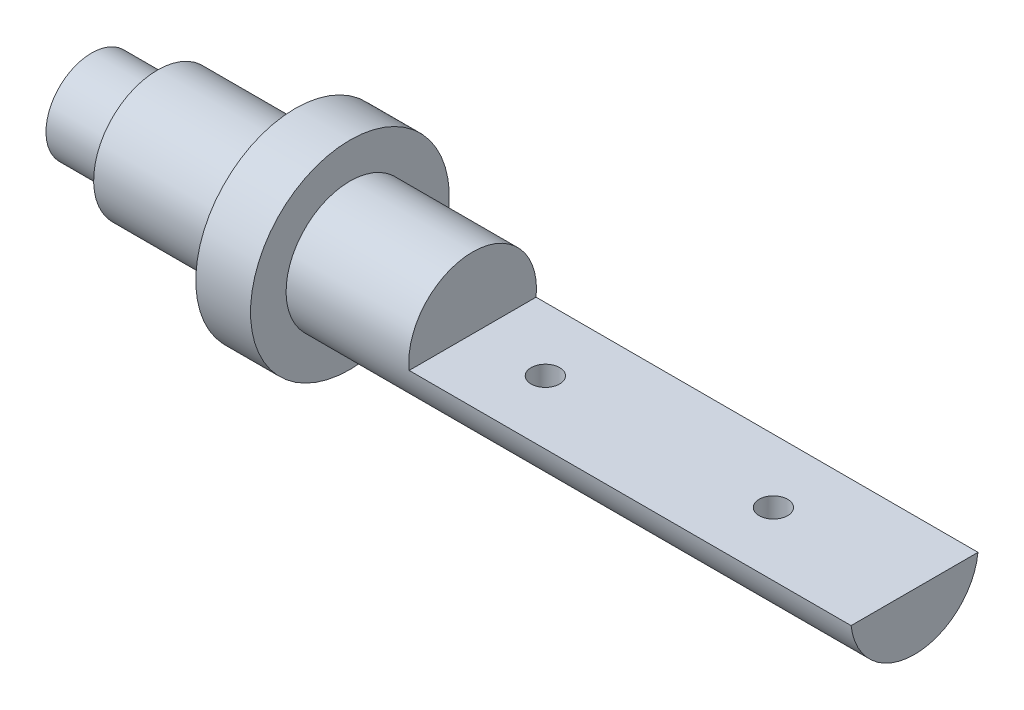
ISO-10303-21;
HEADER;
FILE_DESCRIPTION(('STEP AP214'),'2;1');
FILE_NAME('part.step','',(''),(''),'','','');
FILE_SCHEMA(('AUTOMOTIVE_DESIGN { 1 0 10303 214 1 1 1 1 }'));
ENDSEC;
DATA;
#1=APPLICATION_CONTEXT('core data for automotive mechanical design processes');
#2=APPLICATION_PROTOCOL_DEFINITION('international standard','automotive_design',2000,#1);
#3=PRODUCT_CONTEXT('',#1,'mechanical');
#4=PRODUCT('Part','Part','',(#3));
#5=PRODUCT_RELATED_PRODUCT_CATEGORY('part','',(#4));
#6=PRODUCT_DEFINITION_FORMATION('','',#4);
#7=PRODUCT_DEFINITION_CONTEXT('part definition',#1,'design');
#8=PRODUCT_DEFINITION('design','',#6,#7);
#9=PRODUCT_DEFINITION_SHAPE('','',#8);
#10=(LENGTH_UNIT() NAMED_UNIT(*) SI_UNIT(.MILLI.,.METRE.));
#11=(NAMED_UNIT(*) PLANE_ANGLE_UNIT() SI_UNIT($,.RADIAN.));
#12=(NAMED_UNIT(*) SI_UNIT($,.STERADIAN.) SOLID_ANGLE_UNIT());
#13=UNCERTAINTY_MEASURE_WITH_UNIT(LENGTH_MEASURE(1.E-05),#10,'distance_accuracy_value','');
#14=(GEOMETRIC_REPRESENTATION_CONTEXT(3) GLOBAL_UNCERTAINTY_ASSIGNED_CONTEXT((#13)) GLOBAL_UNIT_ASSIGNED_CONTEXT((#10,
#11,#12)) REPRESENTATION_CONTEXT('',''));
#15=CARTESIAN_POINT('',(0.,0.,0.));
#16=DIRECTION('',(0.,0.,1.));
#17=DIRECTION('',(1.,0.,0.));
#18=AXIS2_PLACEMENT_3D('',#15,#16,#17);
#19=CARTESIAN_POINT('',(167.1,-3.10000000000004,-43.6));
#20=DIRECTION('',(0.,-1.,0.));
#21=DIRECTION('',(0.,0.,-1.));
#22=AXIS2_PLACEMENT_3D('',#19,#20,#21);
#23=PLANE('',#22);
#24=CARTESIAN_POINT('',(199.,-3.10000000000004,0.));
#25=DIRECTION('',(0.,1.,0.));
#26=DIRECTION('',(0.,0.,1.));
#27=AXIS2_PLACEMENT_3D('',#24,#25,#26);
#28=CIRCLE('',#27,6.25000000000001);
#29=CARTESIAN_POINT('',(199.,-3.10000000000004,6.25000000000001));
#30=VERTEX_POINT('',#29);
#31=EDGE_CURVE('E169',#30,#30,#28,.T.);
#32=ORIENTED_EDGE('',*,*,#31,.F.);
#33=EDGE_LOOP('',(#32));
#34=FACE_BOUND('',#33,.T.);
#35=DIRECTION('',(1.,0.,0.));
#36=VECTOR('',#35,1.);
#37=CARTESIAN_POINT('',(360.9,-3.10000000000004,-27.8278637340346));
#38=LINE('',#37,#36);
#39=CARTESIAN_POINT('',(360.9,-3.10000000000004,-27.8278637340346));
#40=VERTEX_POINT('',#39);
#41=CARTESIAN_POINT('',(167.1,-3.10000000000004,-27.8278637340346));
#42=VERTEX_POINT('',#41);
#43=EDGE_CURVE('E80',#40,#42,#38,.F.);
#44=ORIENTED_EDGE('',*,*,#43,.T.);
#45=DIRECTION('',(0.,0.,1.));
#46=VECTOR('',#45,1.);
#47=CARTESIAN_POINT('',(167.1,-3.10000000000004,-43.6));
#48=LINE('',#47,#46);
#49=CARTESIAN_POINT('',(167.1,-3.10000000000004,27.8278637340346));
#50=VERTEX_POINT('',#49);
#51=EDGE_CURVE('E131',#42,#50,#48,.T.);
#52=ORIENTED_EDGE('',*,*,#51,.T.);
#53=DIRECTION('',(1.,0.,0.));
#54=VECTOR('',#53,1.);
#55=CARTESIAN_POINT('',(360.9,-3.10000000000004,27.8278637340346));
#56=LINE('',#55,#54);
#57=CARTESIAN_POINT('',(360.9,-3.10000000000004,27.8278637340346));
#58=VERTEX_POINT('',#57);
#59=EDGE_CURVE('E68',#50,#58,#56,.T.);
#60=ORIENTED_EDGE('',*,*,#59,.T.);
#61=DIRECTION('',(0.,0.,-1.));
#62=VECTOR('',#61,1.);
#63=CARTESIAN_POINT('',(360.9,-3.10000000000004,0.));
#64=LINE('',#63,#62);
#65=EDGE_CURVE('E60',#58,#40,#64,.T.);
#66=ORIENTED_EDGE('',*,*,#65,.T.);
#67=EDGE_LOOP('',(#44,#52,#60,#66));
#68=FACE_BOUND('',#67,.T.);
#69=CARTESIAN_POINT('',(299.,-3.10000000000004,0.));
#70=DIRECTION('',(0.,1.,0.));
#71=DIRECTION('',(0.,0.,1.));
#72=AXIS2_PLACEMENT_3D('',#69,#70,#71);
#73=CIRCLE('',#72,6.25000000000003);
#74=CARTESIAN_POINT('',(299.,-3.10000000000004,6.25000000000003));
#75=VERTEX_POINT('',#74);
#76=EDGE_CURVE('E132',#75,#75,#73,.T.);
#77=ORIENTED_EDGE('',*,*,#76,.F.);
#78=EDGE_LOOP('',(#77));
#79=FACE_BOUND('',#78,.T.);
#80=ADVANCED_FACE('F45',(#34,#68,#79),#23,.F.);
#81=CARTESIAN_POINT('',(0.,0.,0.));
#82=DIRECTION('',(-1.,0.,0.));
#83=DIRECTION('',(0.,-1.,0.));
#84=AXIS2_PLACEMENT_3D('',#81,#82,#83);
#85=PLANE('',#84);
#86=CARTESIAN_POINT('',(0.,0.,0.));
#87=DIRECTION('',(1.,0.,0.));
#88=DIRECTION('',(0.,1.,0.));
#89=AXIS2_PLACEMENT_3D('',#86,#87,#88);
#90=CIRCLE('',#89,20.);
#91=CARTESIAN_POINT('',(0.,20.,0.));
#92=VERTEX_POINT('',#91);
#93=EDGE_CURVE('E85',#92,#92,#90,.T.);
#94=ORIENTED_EDGE('',*,*,#93,.F.);
#95=EDGE_LOOP('',(#94));
#96=FACE_BOUND('',#95,.T.);
#97=ADVANCED_FACE('F47',(#96),#85,.T.);
#98=CARTESIAN_POINT('',(360.9,0.,0.));
#99=DIRECTION('',(1.,0.,0.));
#100=DIRECTION('',(0.,1.,0.));
#101=AXIS2_PLACEMENT_3D('',#98,#99,#100);
#102=CYLINDRICAL_SURFACE('',#101,20.);
#103=ORIENTED_EDGE('',*,*,#93,.T.);
#104=EDGE_LOOP('',(#103));
#105=FACE_BOUND('',#104,.T.);
#106=CARTESIAN_POINT('',(28.9,0.,0.));
#107=DIRECTION('',(1.,0.,0.));
#108=DIRECTION('',(0.,1.,0.));
#109=AXIS2_PLACEMENT_3D('',#106,#107,#108);
#110=CIRCLE('',#109,20.);
#111=CARTESIAN_POINT('',(28.9,20.,0.));
#112=VERTEX_POINT('',#111);
#113=EDGE_CURVE('E118',#112,#112,#110,.T.);
#114=ORIENTED_EDGE('',*,*,#113,.F.);
#115=EDGE_LOOP('',(#114));
#116=FACE_BOUND('',#115,.T.);
#117=ADVANCED_FACE('F252',(#105,#116),#102,.T.);
#118=CARTESIAN_POINT('',(28.9,20.,0.));
#119=DIRECTION('',(-1.,0.,0.));
#120=DIRECTION('',(0.,-1.,0.));
#121=AXIS2_PLACEMENT_3D('',#118,#119,#120);
#122=PLANE('',#121);
#123=ORIENTED_EDGE('',*,*,#113,.T.);
#124=EDGE_LOOP('',(#123));
#125=FACE_BOUND('',#124,.T.);
#126=CARTESIAN_POINT('',(28.9,0.,0.));
#127=DIRECTION('',(1.,0.,0.));
#128=DIRECTION('',(0.,1.,0.));
#129=AXIS2_PLACEMENT_3D('',#126,#127,#128);
#130=CIRCLE('',#129,28.);
#131=CARTESIAN_POINT('',(28.9,28.,0.));
#132=VERTEX_POINT('',#131);
#133=EDGE_CURVE('E114',#132,#132,#130,.T.);
#134=ORIENTED_EDGE('',*,*,#133,.F.);
#135=EDGE_LOOP('',(#134));
#136=FACE_BOUND('',#135,.T.);
#137=ADVANCED_FACE('F242',(#125,#136),#122,.T.);
#138=CARTESIAN_POINT('',(360.9,0.,0.));
#139=DIRECTION('',(1.,0.,0.));
#140=DIRECTION('',(0.,1.,0.));
#141=AXIS2_PLACEMENT_3D('',#138,#139,#140);
#142=CYLINDRICAL_SURFACE('',#141,28.);
#143=ORIENTED_EDGE('',*,*,#133,.T.);
#144=EDGE_LOOP('',(#143));
#145=FACE_BOUND('',#144,.T.);
#146=CARTESIAN_POINT('',(89.3,0.,0.));
#147=DIRECTION('',(1.,0.,0.));
#148=DIRECTION('',(0.,1.,0.));
#149=AXIS2_PLACEMENT_3D('',#146,#147,#148);
#150=CIRCLE('',#149,28.);
#151=CARTESIAN_POINT('',(89.3,28.,0.));
#152=VERTEX_POINT('',#151);
#153=EDGE_CURVE('E110',#152,#152,#150,.T.);
#154=ORIENTED_EDGE('',*,*,#153,.F.);
#155=EDGE_LOOP('',(#154));
#156=FACE_BOUND('',#155,.T.);
#157=ADVANCED_FACE('F232',(#145,#156),#142,.T.);
#158=CARTESIAN_POINT('',(89.3,28.,0.));
#159=DIRECTION('',(-1.,0.,0.));
#160=DIRECTION('',(0.,-1.,0.));
#161=AXIS2_PLACEMENT_3D('',#158,#159,#160);
#162=PLANE('',#161);
#163=ORIENTED_EDGE('',*,*,#153,.T.);
#164=EDGE_LOOP('',(#163));
#165=FACE_BOUND('',#164,.T.);
#166=CARTESIAN_POINT('',(89.3,0.,0.));
#167=DIRECTION('',(1.,0.,0.));
#168=DIRECTION('',(0.,1.,0.));
#169=AXIS2_PLACEMENT_3D('',#166,#167,#168);
#170=CIRCLE('',#169,43.6);
#171=CARTESIAN_POINT('',(89.3,43.6,0.));
#172=VERTEX_POINT('',#171);
#173=EDGE_CURVE('E106',#172,#172,#170,.T.);
#174=ORIENTED_EDGE('',*,*,#173,.F.);
#175=EDGE_LOOP('',(#174));
#176=FACE_BOUND('',#175,.T.);
#177=ADVANCED_FACE('F222',(#165,#176),#162,.T.);
#178=CARTESIAN_POINT('',(360.9,0.,0.));
#179=DIRECTION('',(1.,0.,0.));
#180=DIRECTION('',(0.,1.,0.));
#181=AXIS2_PLACEMENT_3D('',#178,#179,#180);
#182=CYLINDRICAL_SURFACE('',#181,43.6);
#183=ORIENTED_EDGE('',*,*,#173,.T.);
#184=EDGE_LOOP('',(#183));
#185=FACE_BOUND('',#184,.T.);
#186=CARTESIAN_POINT('',(113.3,0.,0.));
#187=DIRECTION('',(1.,0.,0.));
#188=DIRECTION('',(0.,1.,0.));
#189=AXIS2_PLACEMENT_3D('',#186,#187,#188);
#190=CIRCLE('',#189,43.6);
#191=CARTESIAN_POINT('',(113.3,43.6,0.));
#192=VERTEX_POINT('',#191);
#193=EDGE_CURVE('E99',#192,#192,#190,.T.);
#194=ORIENTED_EDGE('',*,*,#193,.F.);
#195=EDGE_LOOP('',(#194));
#196=FACE_BOUND('',#195,.T.);
#197=ADVANCED_FACE('F157',(#185,#196),#182,.T.);
#198=CARTESIAN_POINT('',(113.3,43.6,0.));
#199=DIRECTION('',(1.,0.,0.));
#200=DIRECTION('',(0.,1.,0.));
#201=AXIS2_PLACEMENT_3D('',#198,#199,#200);
#202=PLANE('',#201);
#203=ORIENTED_EDGE('',*,*,#193,.T.);
#204=EDGE_LOOP('',(#203));
#205=FACE_BOUND('',#204,.T.);
#206=CARTESIAN_POINT('',(113.3,0.,0.));
#207=DIRECTION('',(1.,0.,0.));
#208=DIRECTION('',(0.,1.,0.));
#209=AXIS2_PLACEMENT_3D('',#206,#207,#208);
#210=CIRCLE('',#209,28.);
#211=CARTESIAN_POINT('',(113.3,28.,0.));
#212=VERTEX_POINT('',#211);
#213=EDGE_CURVE('E95',#212,#212,#210,.T.);
#214=ORIENTED_EDGE('',*,*,#213,.F.);
#215=EDGE_LOOP('',(#214));
#216=FACE_BOUND('',#215,.T.);
#217=ADVANCED_FACE('F153',(#205,#216),#202,.T.);
#218=CARTESIAN_POINT('',(360.9,0.,0.));
#219=DIRECTION('',(1.,0.,0.));
#220=DIRECTION('',(0.,1.,0.));
#221=AXIS2_PLACEMENT_3D('',#218,#219,#220);
#222=CYLINDRICAL_SURFACE('',#221,28.);
#223=CARTESIAN_POINT('',(199.,-27.2935431924841,6.25000000000001));
#224=CARTESIAN_POINT('',(198.826772759869,-27.2935406630598,6.25000418094473));
#225=CARTESIAN_POINT('',(198.653594583877,-27.295195294476,6.24279659776609));
#226=CARTESIAN_POINT('',(198.308445204921,-27.3017584796592,6.21403440350836));
#227=CARTESIAN_POINT('',(198.1364741812,-27.3066675067385,6.19247770552275));
#228=CARTESIAN_POINT('',(197.794963014681,-27.3195986301188,6.13517608334991));
#229=CARTESIAN_POINT('',(197.625423958102,-27.3276220751525,6.09942501198105));
#230=CARTESIAN_POINT('',(197.289985283219,-27.3465464155528,6.0140096724512));
#231=CARTESIAN_POINT('',(197.124087031793,-27.3574483722472,5.96434027208897));
#232=CARTESIAN_POINT('',(196.79739823919,-27.3817905916842,5.8515692430011));
#233=CARTESIAN_POINT('',(196.636600346177,-27.3952269869803,5.78848806167797));
#234=CARTESIAN_POINT('',(196.320879039308,-27.4242678496655,5.64929956777814));
#235=CARTESIAN_POINT('',(196.165957819931,-27.4398731170088,5.57318744653333));
#236=CARTESIAN_POINT('',(195.863139675886,-27.4728000717142,5.408539343459));
#237=CARTESIAN_POINT('',(195.715239939892,-27.4901210633972,5.32000839111389));
#238=CARTESIAN_POINT('',(195.427304807542,-27.5260101395213,5.13108281812591));
#239=CARTESIAN_POINT('',(195.287272386179,-27.5445786899706,5.03068375356067));
#240=CARTESIAN_POINT('',(195.013935535353,-27.5827411710544,4.81708795276356));
#241=CARTESIAN_POINT('',(194.880768388947,-27.6023465077546,4.70371753740177));
#242=CARTESIAN_POINT('',(194.624367602939,-27.6417727676251,4.46619442991223));
#243=CARTESIAN_POINT('',(194.501137665901,-27.6615937680574,4.34203775433222));
#244=CARTESIAN_POINT('',(194.265523242344,-27.700889474895,4.08384197537744));
#245=CARTESIAN_POINT('',(194.153135671948,-27.7203642784752,3.94980570128878));
#246=CARTESIAN_POINT('',(193.939893741983,-27.7584430824459,3.67265674935634));
#247=CARTESIAN_POINT('',(193.839043646761,-27.7770467593695,3.52954074575628));
#248=CARTESIAN_POINT('',(193.648624564621,-27.813052346094,3.23365995739576));
#249=CARTESIAN_POINT('',(193.559186955487,-27.8304393713551,3.08080874633999));
#250=CARTESIAN_POINT('',(193.393497928413,-27.8633050823482,2.7678516760048));
#251=CARTESIAN_POINT('',(193.317251473738,-27.8787830491572,2.60774311456662));
#252=CARTESIAN_POINT('',(193.178606172387,-27.9073737582623,2.28150107379449));
#253=CARTESIAN_POINT('',(193.116200934247,-27.9204875917193,2.11537041669149));
#254=CARTESIAN_POINT('',(193.00567560503,-27.9439896454641,1.77823756423969));
#255=CARTESIAN_POINT('',(192.957560676261,-27.9543768806238,1.60723363283173));
#256=CARTESIAN_POINT('',(192.836694005375,-27.9806601200355,1.09439758323674));
#257=CARTESIAN_POINT('',(192.784988483422,-27.9921960538676,0.74699422202766));
#258=CARTESIAN_POINT('',(192.751534661022,-27.9996585490208,0.223520525139065));
#259=CARTESIAN_POINT('',(192.747741429726,-28.0005041840466,0.0485642360945712));
#260=CARTESIAN_POINT('',(192.754808971572,-27.9989265851301,-0.301058844425914));
#261=CARTESIAN_POINT('',(192.765669948848,-27.9965033056516,-0.475725631835185));
#262=CARTESIAN_POINT('',(192.819554977227,-27.984529892505,-0.991080970449527));
#263=CARTESIAN_POINT('',(192.883476976027,-27.970364519702,-1.32971272514981));
#264=CARTESIAN_POINT('',(193.065716376935,-27.9310839487509,-1.99113945055513));
#265=CARTESIAN_POINT('',(193.184036304365,-27.9059682422566,-2.31393368526249));
#266=CARTESIAN_POINT('',(193.472613693557,-27.8472521946705,-2.93758195962192));
#267=CARTESIAN_POINT('',(193.643257248304,-27.813589111637,-3.23825157149136));
#268=CARTESIAN_POINT('',(194.031348644581,-27.7414625355303,-3.80704732566788));
#269=CARTESIAN_POINT('',(194.248803107967,-27.7029983636205,-4.07516885533366));
#270=CARTESIAN_POINT('',(194.729924683463,-27.6245113562129,-4.57738580559887));
#271=CARTESIAN_POINT('',(194.994490686192,-27.5844728055815,-4.810618498648));
#272=CARTESIAN_POINT('',(195.559395719265,-27.5081274935843,-5.22957036099766));
#273=CARTESIAN_POINT('',(195.859735802028,-27.4718208420637,-5.41528813197725));
#274=CARTESIAN_POINT('',(196.48909832967,-27.4070063654905,-5.73434528879877));
#275=CARTESIAN_POINT('',(196.818209250125,-27.3785237986947,-5.86751562740585));
#276=CARTESIAN_POINT('',(197.494926272324,-27.3329281069129,-6.07639622505651));
#277=CARTESIAN_POINT('',(197.842529294842,-27.3158130954113,-6.15211601866805));
#278=CARTESIAN_POINT('',(198.538463469748,-27.2952766976966,-6.24259542089443));
#279=CARTESIAN_POINT('',(198.886622794773,-27.291572561069,-6.25861396727173));
#280=CARTESIAN_POINT('',(199.580637266418,-27.2975136372092,-6.23264970129104));
#281=CARTESIAN_POINT('',(199.926492576648,-27.3071578917232,-6.1906710524346));
#282=CARTESIAN_POINT('',(200.601658787116,-27.3384415167486,-6.05099829572651));
#283=CARTESIAN_POINT('',(200.931121853203,-27.3599303668854,-5.95400289682963));
#284=CARTESIAN_POINT('',(201.569119561196,-27.4123452195023,-5.70780773520872));
#285=CARTESIAN_POINT('',(201.877652128473,-27.4432721558189,-5.55860280648197));
#286=CARTESIAN_POINT('',(202.470462153433,-27.5116960387506,-5.20947386615222));
#287=CARTESIAN_POINT('',(202.75427323904,-27.5492900747216,-5.00877748022628));
#288=CARTESIAN_POINT('',(203.284653800083,-27.6265592430672,-4.56335143969623));
#289=CARTESIAN_POINT('',(203.531218441614,-27.6662346446661,-4.31861607865888));
#290=CARTESIAN_POINT('',(203.98500466893,-27.7441297258462,-3.78641602648038));
#291=CARTESIAN_POINT('',(204.19136592114,-27.7823059698252,-3.4982115890515));
#292=CARTESIAN_POINT('',(204.552791761544,-27.8520981732881,-2.89029963896408));
#293=CARTESIAN_POINT('',(204.707858796504,-27.8837144456601,-2.57059362989542));
#294=CARTESIAN_POINT('',(204.897887719815,-27.9234467514471,-2.07570333708497));
#295=CARTESIAN_POINT('',(204.954038169116,-27.9353862929346,-1.90866854996691));
#296=CARTESIAN_POINT('',(205.052074197087,-27.9564443638961,-1.57030628341012));
#297=CARTESIAN_POINT('',(205.093965069283,-27.9655639400989,-1.39898042234157));
#298=CARTESIAN_POINT('',(205.163133940246,-27.9807181181667,-1.05326831573387));
#299=CARTESIAN_POINT('',(205.190410923789,-27.986752505703,-0.878881858444677));
#300=CARTESIAN_POINT('',(205.230124734713,-27.9955635060913,-0.528347318502328));
#301=CARTESIAN_POINT('',(205.242562155382,-27.9983402491843,-0.352199306560279));
#302=CARTESIAN_POINT('',(205.252382704856,-28.0005315872801,-0.00328258899921763));
#303=CARTESIAN_POINT('',(205.250085760547,-28.0000176335598,0.169476763448785));
#304=CARTESIAN_POINT('',(205.231205252523,-27.995809223028,0.514171279855304));
#305=CARTESIAN_POINT('',(205.214621979942,-27.9921148310289,0.68610646053738));
#306=CARTESIAN_POINT('',(205.167300889138,-27.9816470037884,1.02794898351239));
#307=CARTESIAN_POINT('',(205.136560840508,-27.9748730833677,1.19785600193814));
#308=CARTESIAN_POINT('',(205.061186498783,-27.9584357777394,1.53435186906269));
#309=CARTESIAN_POINT('',(205.016557147495,-27.9487734202847,1.70094187555781));
#310=CARTESIAN_POINT('',(204.91391333612,-27.9268574568711,2.02918872938454));
#311=CARTESIAN_POINT('',(204.855941549387,-27.914612122305,2.19085948233517));
#312=CARTESIAN_POINT('',(204.726996614568,-27.8878471112106,2.50866639727837));
#313=CARTESIAN_POINT('',(204.656028036642,-27.8733282344044,2.66480448180286));
#314=CARTESIAN_POINT('',(204.501559769507,-27.8423945526457,2.97063998638388));
#315=CARTESIAN_POINT('',(204.418054753125,-27.8259789423909,3.12033463343338));
#316=CARTESIAN_POINT('',(204.239153331803,-27.7916988602937,3.4121928894429));
#317=CARTESIAN_POINT('',(204.143760941799,-27.7738348783442,3.55435901815256));
#318=CARTESIAN_POINT('',(203.939680676552,-27.7367568229685,3.83307740152884));
#319=CARTESIAN_POINT('',(203.830764581969,-27.7175228620527,3.96945995543581));
#320=CARTESIAN_POINT('',(203.601992902721,-27.6785682794899,4.23255724998561));
#321=CARTESIAN_POINT('',(203.482141120766,-27.6588478287394,4.35927532336929));
#322=CARTESIAN_POINT('',(203.232190697746,-27.6194442852869,4.60233284521471));
#323=CARTESIAN_POINT('',(203.102085955803,-27.5997612220746,4.71866602514746));
#324=CARTESIAN_POINT('',(202.832602018594,-27.5609972321727,4.94004645388398));
#325=CARTESIAN_POINT('',(202.693226229135,-27.5419160881187,5.04509781049823));
#326=CARTESIAN_POINT('',(202.403995171382,-27.5046146614128,5.24467646780604));
#327=CARTESIAN_POINT('',(202.254017467704,-27.4864108262582,5.33902953184629));
#328=CARTESIAN_POINT('',(201.946502220708,-27.4517038520394,5.51470510633686));
#329=CARTESIAN_POINT('',(201.788967489404,-27.4352000874544,5.59603241561454));
#330=CARTESIAN_POINT('',(201.467459281152,-27.4043843599853,5.74504238460737));
#331=CARTESIAN_POINT('',(201.303489319597,-27.3900712207975,5.81273237339839));
#332=CARTESIAN_POINT('',(200.97025885759,-27.364060344737,5.9339725480609));
#333=CARTESIAN_POINT('',(200.8009992932,-27.3523621480711,5.98752522003902));
#334=CARTESIAN_POINT('',(200.364711263261,-27.3263643748796,6.10534932009699));
#335=CARTESIAN_POINT('',(200.094756275629,-27.3141314337926,6.15951030297509));
#336=CARTESIAN_POINT('',(199.549826175448,-27.2977230622745,6.2318313742948));
#337=CARTESIAN_POINT('',(199.274851329116,-27.2935472058001,6.24999336629613));
#338=CARTESIAN_POINT('',(199.,-27.2935431924841,6.25000000000001));
#339=B_SPLINE_CURVE_WITH_KNOTS('',3,(#223,#224,#225,#226,#227,#228,#229,#230,#231,#232,#233,
#234,#235,#236,#237,#238,#239,#240,#241,#242,#243,#244,#245,#246,#247,#248,#249,#250,#251,#252,
#253,#254,#255,#256,#257,#258,#259,#260,#261,#262,#263,#264,#265,#266,#267,#268,#269,#270,#271,
#272,#273,#274,#275,#276,#277,#278,#279,#280,#281,#282,#283,#284,#285,#286,#287,#288,#289,#290,
#291,#292,#293,#294,#295,#296,#297,#298,#299,#300,#301,#302,#303,#304,#305,#306,#307,#308,#309,
#310,#311,#312,#313,#314,#315,#316,#317,#318,#319,#320,#321,#322,#323,#324,#325,#326,#327,#328,
#329,#330,#331,#332,#333,#334,#335,#336,#337,#338),.UNSPECIFIED.,.T.,.F.,(4,2,2,2,2,2,2,2,2,2,2,
2,2,2,2,2,2,2,2,2,2,2,2,2,2,2,2,2,2,2,2,2,2,2,2,2,2,2,2,2,2,2,2,2,2,2,2,2,2,2,2,2,2,2,2,2,2,4),
(0.,0.519439608500139,1.03895477976753,1.5586951841997,2.07862748884639,2.5977727248206,
3.11710994995223,3.63623745343969,4.15555995961573,4.68290174643608,5.21043911948487,
5.73782600077033,6.26540718315181,6.79859906273962,7.33199112529035,7.86513636801501,
8.39847397341279,9.44659898859374,9.97108019976342,10.4955687170816,11.5250017072293,
12.5544824917318,13.5917504134609,14.6291651632887,15.6890487552906,16.7489635351156,
17.8122608342571,18.8753816285583,19.9159529707268,20.9564496162611,21.9840187566688,
23.0116896012438,24.0557822772238,25.10001034103,26.1645877935077,27.229114457624,
27.7584522517356,28.2875933270914,28.8167711569939,29.3459278295957,29.8636344148691,
30.3813304503266,30.8991080770091,31.4167016888243,31.9326623270648,32.4484418813475,
32.9644412321529,33.4802667751748,34.0064342303607,34.5324194115064,35.0587199707589,
35.5848282449849,36.1185476697549,36.6520700120354,37.1853048551528,37.7184458641198,
38.542659288208,39.3668291282597),.UNSPECIFIED.);
#340=CARTESIAN_POINT('',(199.,-27.2935431924841,6.25000000000001));
#341=VERTEX_POINT('',#340);
#342=EDGE_CURVE('E49',#341,#341,#339,.T.);
#343=ORIENTED_EDGE('',*,*,#342,.F.);
#344=EDGE_LOOP('',(#343));
#345=FACE_BOUND('',#344,.T.);
#346=CARTESIAN_POINT('',(299.,-27.2935431924841,6.25000000000003));
#347=CARTESIAN_POINT('',(298.826772759869,-27.2935406630598,6.25000418094476));
#348=CARTESIAN_POINT('',(298.653594583876,-27.295195294476,6.24279659776612));
#349=CARTESIAN_POINT('',(298.308445204921,-27.3017584796592,6.21403440350839));
#350=CARTESIAN_POINT('',(298.1364741812,-27.3066675067385,6.19247770552278));
#351=CARTESIAN_POINT('',(297.794963014681,-27.3195986301188,6.13517608334994));
#352=CARTESIAN_POINT('',(297.625423958102,-27.3276220751524,6.09942501198109));
#353=CARTESIAN_POINT('',(297.289985283219,-27.3465464155528,6.01400967245124));
#354=CARTESIAN_POINT('',(297.124087031793,-27.3574483722472,5.964340272089));
#355=CARTESIAN_POINT('',(296.79739823919,-27.3817905916842,5.85156924300113));
#356=CARTESIAN_POINT('',(296.636600346177,-27.3952269869803,5.788488061678));
#357=CARTESIAN_POINT('',(296.320879039308,-27.4242678496655,5.64929956777816));
#358=CARTESIAN_POINT('',(296.165957819931,-27.4398731170088,5.57318744653336));
#359=CARTESIAN_POINT('',(295.863139675886,-27.4728000717141,5.40853934345903));
#360=CARTESIAN_POINT('',(295.715239939892,-27.4901210633972,5.32000839111392));
#361=CARTESIAN_POINT('',(295.427304807542,-27.5260101395213,5.13108281812594));
#362=CARTESIAN_POINT('',(295.287272386179,-27.5445786899705,5.0306837535607));
#363=CARTESIAN_POINT('',(295.013935535353,-27.5827411710544,4.81708795276359));
#364=CARTESIAN_POINT('',(294.880768388947,-27.6023465077546,4.70371753740181));
#365=CARTESIAN_POINT('',(294.624367602939,-27.6417727676251,4.46619442991226));
#366=CARTESIAN_POINT('',(294.501137665901,-27.6615937680574,4.34203775433225));
#367=CARTESIAN_POINT('',(294.265523242344,-27.700889474895,4.08384197537745));
#368=CARTESIAN_POINT('',(294.153135671949,-27.7203642784752,3.94980570128878));
#369=CARTESIAN_POINT('',(293.939893741983,-27.7584430824458,3.67265674935634));
#370=CARTESIAN_POINT('',(293.839043646761,-27.7770467593695,3.52954074575628));
#371=CARTESIAN_POINT('',(293.648624564621,-27.813052346094,3.23365995739577));
#372=CARTESIAN_POINT('',(293.559186955487,-27.8304393713551,3.08080874634002));
#373=CARTESIAN_POINT('',(293.393497928413,-27.8633050823482,2.76785167600483));
#374=CARTESIAN_POINT('',(293.317251473738,-27.8787830491572,2.60774311456664));
#375=CARTESIAN_POINT('',(293.178606172387,-27.9073737582623,2.28150107379449));
#376=CARTESIAN_POINT('',(293.116200934247,-27.9204875917192,2.11537041669148));
#377=CARTESIAN_POINT('',(293.00567560503,-27.9439896454641,1.77823756423967));
#378=CARTESIAN_POINT('',(292.957560676261,-27.9543768806238,1.60723363283171));
#379=CARTESIAN_POINT('',(292.836694005375,-27.9806601200354,1.09439758323672));
#380=CARTESIAN_POINT('',(292.784988483422,-27.9921960538676,0.74699422202765));
#381=CARTESIAN_POINT('',(292.751534661022,-27.9996585490208,0.223520525139062));
#382=CARTESIAN_POINT('',(292.747741429726,-28.0005041840466,0.0485642360945689));
#383=CARTESIAN_POINT('',(292.754808971572,-27.9989265851301,-0.301058844425915));
#384=CARTESIAN_POINT('',(292.765669948848,-27.9965033056516,-0.475725631835184));
#385=CARTESIAN_POINT('',(292.819554977227,-27.984529892505,-0.991080970449527));
#386=CARTESIAN_POINT('',(292.883476976027,-27.970364519702,-1.32971272514981));
#387=CARTESIAN_POINT('',(293.065716376935,-27.9310839487509,-1.99113945055514));
#388=CARTESIAN_POINT('',(293.184036304365,-27.9059682422566,-2.31393368526251));
#389=CARTESIAN_POINT('',(293.472613693557,-27.8472521946705,-2.93758195962193));
#390=CARTESIAN_POINT('',(293.643257248304,-27.813589111637,-3.23825157149137));
#391=CARTESIAN_POINT('',(294.031348644581,-27.7414625355303,-3.80704732566789));
#392=CARTESIAN_POINT('',(294.248803107967,-27.7029983636205,-4.07516885533368));
#393=CARTESIAN_POINT('',(294.729924683463,-27.6245113562129,-4.5773858055989));
#394=CARTESIAN_POINT('',(294.994490686192,-27.5844728055815,-4.81061849864804));
#395=CARTESIAN_POINT('',(295.559395719265,-27.5081274935843,-5.22957036099769));
#396=CARTESIAN_POINT('',(295.859735802028,-27.4718208420637,-5.41528813197727));
#397=CARTESIAN_POINT('',(296.48909832967,-27.4070063654905,-5.7343452887988));
#398=CARTESIAN_POINT('',(296.818209250125,-27.3785237986947,-5.86751562740589));
#399=CARTESIAN_POINT('',(297.494926272324,-27.3329281069129,-6.07639622505655));
#400=CARTESIAN_POINT('',(297.842529294842,-27.3158130954113,-6.15211601866808));
#401=CARTESIAN_POINT('',(298.538463469748,-27.2952766976966,-6.24259542089446));
#402=CARTESIAN_POINT('',(298.886622794773,-27.2915725610689,-6.25861396727175));
#403=CARTESIAN_POINT('',(299.580637266418,-27.2975136372092,-6.23264970129107));
#404=CARTESIAN_POINT('',(299.926492576648,-27.3071578917232,-6.19067105243462));
#405=CARTESIAN_POINT('',(300.601658787116,-27.3384415167486,-6.05099829572652));
#406=CARTESIAN_POINT('',(300.931121853203,-27.3599303668853,-5.95400289682965));
#407=CARTESIAN_POINT('',(301.569119561196,-27.4123452195023,-5.70780773520875));
#408=CARTESIAN_POINT('',(301.877652128473,-27.4432721558189,-5.55860280648199));
#409=CARTESIAN_POINT('',(302.470462153433,-27.5116960387506,-5.20947386615224));
#410=CARTESIAN_POINT('',(302.754273239041,-27.5492900747216,-5.0087774802263));
#411=CARTESIAN_POINT('',(303.284653800083,-27.6265592430672,-4.56335143969626));
#412=CARTESIAN_POINT('',(303.531218441614,-27.6662346446661,-4.31861607865893));
#413=CARTESIAN_POINT('',(303.98500466893,-27.7441297258462,-3.78641602648045));
#414=CARTESIAN_POINT('',(304.19136592114,-27.7823059698252,-3.49821158905157));
#415=CARTESIAN_POINT('',(304.552791761544,-27.8520981732881,-2.89029963896413));
#416=CARTESIAN_POINT('',(304.707858796504,-27.88371444566,-2.57059362989545));
#417=CARTESIAN_POINT('',(304.897887719815,-27.9234467514471,-2.07570333708499));
#418=CARTESIAN_POINT('',(304.954038169116,-27.9353862929346,-1.90866854996693));
#419=CARTESIAN_POINT('',(305.052074197087,-27.956444363896,-1.57030628341014));
#420=CARTESIAN_POINT('',(305.093965069283,-27.9655639400989,-1.39898042234158));
#421=CARTESIAN_POINT('',(305.163133940246,-27.9807181181667,-1.05326831573387));
#422=CARTESIAN_POINT('',(305.190410923789,-27.986752505703,-0.878881858444681));
#423=CARTESIAN_POINT('',(305.230124734713,-27.9955635060913,-0.528347318502331));
#424=CARTESIAN_POINT('',(305.242562155382,-27.9983402491843,-0.35219930656028));
#425=CARTESIAN_POINT('',(305.252382704856,-28.0005315872801,-0.00328258899922164));
#426=CARTESIAN_POINT('',(305.250085760547,-28.0000176335598,0.169476763448778));
#427=CARTESIAN_POINT('',(305.231205252523,-27.995809223028,0.514171279855296));
#428=CARTESIAN_POINT('',(305.214621979942,-27.9921148310289,0.686106460537374));
#429=CARTESIAN_POINT('',(305.167300889138,-27.9816470037884,1.02794898351239));
#430=CARTESIAN_POINT('',(305.136560840508,-27.9748730833677,1.19785600193814));
#431=CARTESIAN_POINT('',(305.061186498783,-27.9584357777394,1.53435186906269));
#432=CARTESIAN_POINT('',(305.016557147495,-27.9487734202847,1.70094187555782));
#433=CARTESIAN_POINT('',(304.91391333612,-27.9268574568711,2.02918872938454));
#434=CARTESIAN_POINT('',(304.855941549388,-27.914612122305,2.19085948233518));
#435=CARTESIAN_POINT('',(304.726996614568,-27.8878471112106,2.50866639727838));
#436=CARTESIAN_POINT('',(304.656028036642,-27.8733282344044,2.66480448180286));
#437=CARTESIAN_POINT('',(304.501559769507,-27.8423945526457,2.97063998638389));
#438=CARTESIAN_POINT('',(304.418054753125,-27.8259789423909,3.1203346334334));
#439=CARTESIAN_POINT('',(304.239153331803,-27.7916988602937,3.41219288944292));
#440=CARTESIAN_POINT('',(304.143760941799,-27.7738348783442,3.55435901815256));
#441=CARTESIAN_POINT('',(303.939680676553,-27.7367568229685,3.83307740152884));
#442=CARTESIAN_POINT('',(303.83076458197,-27.7175228620527,3.96945995543581));
#443=CARTESIAN_POINT('',(303.601992902721,-27.6785682794899,4.23255724998562));
#444=CARTESIAN_POINT('',(303.482141120766,-27.6588478287393,4.35927532336931));
#445=CARTESIAN_POINT('',(303.232190697746,-27.6194442852869,4.60233284521472));
#446=CARTESIAN_POINT('',(303.102085955803,-27.5997612220745,4.71866602514746));
#447=CARTESIAN_POINT('',(302.832602018594,-27.5609972321727,4.94004645388398));
#448=CARTESIAN_POINT('',(302.693226229135,-27.5419160881187,5.04509781049825));
#449=CARTESIAN_POINT('',(302.403995171382,-27.5046146614128,5.24467646780607));
#450=CARTESIAN_POINT('',(302.254017467704,-27.4864108262582,5.33902953184632));
#451=CARTESIAN_POINT('',(301.946502220708,-27.4517038520394,5.51470510633688));
#452=CARTESIAN_POINT('',(301.788967489404,-27.4352000874544,5.59603241561456));
#453=CARTESIAN_POINT('',(301.467459281153,-27.4043843599853,5.74504238460739));
#454=CARTESIAN_POINT('',(301.303489319597,-27.3900712207975,5.81273237339841));
#455=CARTESIAN_POINT('',(300.97025885759,-27.364060344737,5.93397254806092));
#456=CARTESIAN_POINT('',(300.8009992932,-27.3523621480711,5.98752522003905));
#457=CARTESIAN_POINT('',(300.364711263261,-27.3263643748796,6.10534932009701));
#458=CARTESIAN_POINT('',(300.094756275629,-27.3141314337926,6.15951030297512));
#459=CARTESIAN_POINT('',(299.549826175448,-27.2977230622745,6.23183137429483));
#460=CARTESIAN_POINT('',(299.274851329116,-27.2935472058001,6.24999336629615));
#461=CARTESIAN_POINT('',(299.,-27.2935431924841,6.25000000000003));
#462=B_SPLINE_CURVE_WITH_KNOTS('',3,(#346,#347,#348,#349,#350,#351,#352,#353,#354,#355,#356,
#357,#358,#359,#360,#361,#362,#363,#364,#365,#366,#367,#368,#369,#370,#371,#372,#373,#374,#375,
#376,#377,#378,#379,#380,#381,#382,#383,#384,#385,#386,#387,#388,#389,#390,#391,#392,#393,#394,
#395,#396,#397,#398,#399,#400,#401,#402,#403,#404,#405,#406,#407,#408,#409,#410,#411,#412,#413,
#414,#415,#416,#417,#418,#419,#420,#421,#422,#423,#424,#425,#426,#427,#428,#429,#430,#431,#432,
#433,#434,#435,#436,#437,#438,#439,#440,#441,#442,#443,#444,#445,#446,#447,#448,#449,#450,#451,
#452,#453,#454,#455,#456,#457,#458,#459,#460,#461),.UNSPECIFIED.,.T.,.F.,(4,2,2,2,2,2,2,2,2,2,2,
2,2,2,2,2,2,2,2,2,2,2,2,2,2,2,2,2,2,2,2,2,2,2,2,2,2,2,2,2,2,2,2,2,2,2,2,2,2,2,2,2,2,2,2,2,2,4),
(0.,0.519439608500166,1.03895477976747,1.55869518419967,2.07862748884639,2.5977727248206,
3.11710994995223,3.63623745343966,4.1555599596157,4.68290174643609,5.2104391194849,
5.73782600077037,6.26540718315184,6.79859906273963,7.33199112529039,7.86513636801506,
8.39847397341285,9.44659898859378,9.97108019976347,10.4955687170817,11.5250017072294,
12.5544824917319,13.5917504134609,14.6291651632888,15.6890487552907,16.7489635351157,
17.8122608342572,18.8753816285584,19.9159529707268,20.9564496162612,21.9840187566688,
23.0116896012439,24.0557822772238,25.1000103410301,26.1645877935078,27.2291144576241,
27.7584522517357,28.2875933270915,28.8167711569941,29.3459278295958,29.8636344148692,
30.3813304503267,30.8991080770093,31.4167016888245,31.932662327065,32.4484418813476,
32.964441232153,33.4802667751749,34.0064342303608,34.5324194115066,35.058719970759,
35.5848282449851,36.1185476697551,36.6520700120356,37.1853048551529,37.71844586412,
38.5426592882082,39.3668291282599),.UNSPECIFIED.);
#463=CARTESIAN_POINT('',(299.,-27.2935431924841,6.25000000000003));
#464=VERTEX_POINT('',#463);
#465=EDGE_CURVE('E124',#464,#464,#462,.T.);
#466=ORIENTED_EDGE('',*,*,#465,.F.);
#467=EDGE_LOOP('',(#466));
#468=FACE_BOUND('',#467,.T.);
#469=ORIENTED_EDGE('',*,*,#43,.F.);
#470=CARTESIAN_POINT('',(360.9,0.,0.));
#471=DIRECTION('',(1.,0.,0.));
#472=DIRECTION('',(0.,1.,0.));
#473=AXIS2_PLACEMENT_3D('',#470,#471,#472);
#474=CIRCLE('',#473,27.9999999999999);
#475=EDGE_CURVE('E90',#58,#40,#474,.T.);
#476=ORIENTED_EDGE('',*,*,#475,.F.);
#477=ORIENTED_EDGE('',*,*,#59,.F.);
#478=CARTESIAN_POINT('',(167.1,0.,0.));
#479=DIRECTION('',(-1.,0.,0.));
#480=DIRECTION('',(0.,0.,1.));
#481=AXIS2_PLACEMENT_3D('',#478,#479,#480);
#482=CIRCLE('',#481,28.);
#483=EDGE_CURVE('E11',#42,#50,#482,.F.);
#484=ORIENTED_EDGE('',*,*,#483,.F.);
#485=EDGE_LOOP('',(#469,#476,#477,#484));
#486=FACE_BOUND('',#485,.T.);
#487=ORIENTED_EDGE('',*,*,#213,.T.);
#488=EDGE_LOOP('',(#487));
#489=FACE_BOUND('',#488,.T.);
#490=ADVANCED_FACE('F88',(#345,#468,#486,#489),#222,.T.);
#491=CARTESIAN_POINT('',(360.9,28.,0.));
#492=DIRECTION('',(1.,0.,0.));
#493=DIRECTION('',(0.,1.,0.));
#494=AXIS2_PLACEMENT_3D('',#491,#492,#493);
#495=PLANE('',#494);
#496=ORIENTED_EDGE('',*,*,#65,.F.);
#497=ORIENTED_EDGE('',*,*,#475,.T.);
#498=EDGE_LOOP('',(#496,#497));
#499=FACE_BOUND('',#498,.T.);
#500=ADVANCED_FACE('F93',(#499),#495,.T.);
#501=CARTESIAN_POINT('',(167.1,28.,-43.6));
#502=DIRECTION('',(-1.,0.,0.));
#503=DIRECTION('',(0.,0.,1.));
#504=AXIS2_PLACEMENT_3D('',#501,#502,#503);
#505=PLANE('',#504);
#506=ORIENTED_EDGE('',*,*,#51,.F.);
#507=ORIENTED_EDGE('',*,*,#483,.T.);
#508=EDGE_LOOP('',(#506,#507));
#509=FACE_BOUND('',#508,.T.);
#510=ADVANCED_FACE('F141',(#509),#505,.F.);
#511=CARTESIAN_POINT('',(299.,-3.10000000000004,0.));
#512=DIRECTION('',(0.,1.,0.));
#513=DIRECTION('',(0.,0.,1.));
#514=AXIS2_PLACEMENT_3D('',#511,#512,#513);
#515=CYLINDRICAL_SURFACE('',#514,6.25000000000003);
#516=ORIENTED_EDGE('',*,*,#465,.T.);
#517=EDGE_LOOP('',(#516));
#518=FACE_BOUND('',#517,.T.);
#519=ORIENTED_EDGE('',*,*,#76,.T.);
#520=EDGE_LOOP('',(#519));
#521=FACE_BOUND('',#520,.T.);
#522=ADVANCED_FACE('F136',(#518,#521),#515,.F.);
#523=CARTESIAN_POINT('',(199.,-3.10000000000004,0.));
#524=DIRECTION('',(0.,1.,0.));
#525=DIRECTION('',(0.,0.,1.));
#526=AXIS2_PLACEMENT_3D('',#523,#524,#525);
#527=CYLINDRICAL_SURFACE('',#526,6.25000000000001);
#528=ORIENTED_EDGE('',*,*,#342,.T.);
#529=EDGE_LOOP('',(#528));
#530=FACE_BOUND('',#529,.T.);
#531=ORIENTED_EDGE('',*,*,#31,.T.);
#532=EDGE_LOOP('',(#531));
#533=FACE_BOUND('',#532,.T.);
#534=ADVANCED_FACE('F140',(#530,#533),#527,.F.);
#535=CLOSED_SHELL('',(#80,#97,#117,#137,#157,#177,#197,#217,#490,#500,#510,#522,#534));
#536=MANIFOLD_SOLID_BREP('B2',#535);
#537=ADVANCED_BREP_SHAPE_REPRESENTATION('',(#18,#536),#14);
#538=SHAPE_DEFINITION_REPRESENTATION(#9,#537);
ENDSEC;
END-ISO-10303-21;
